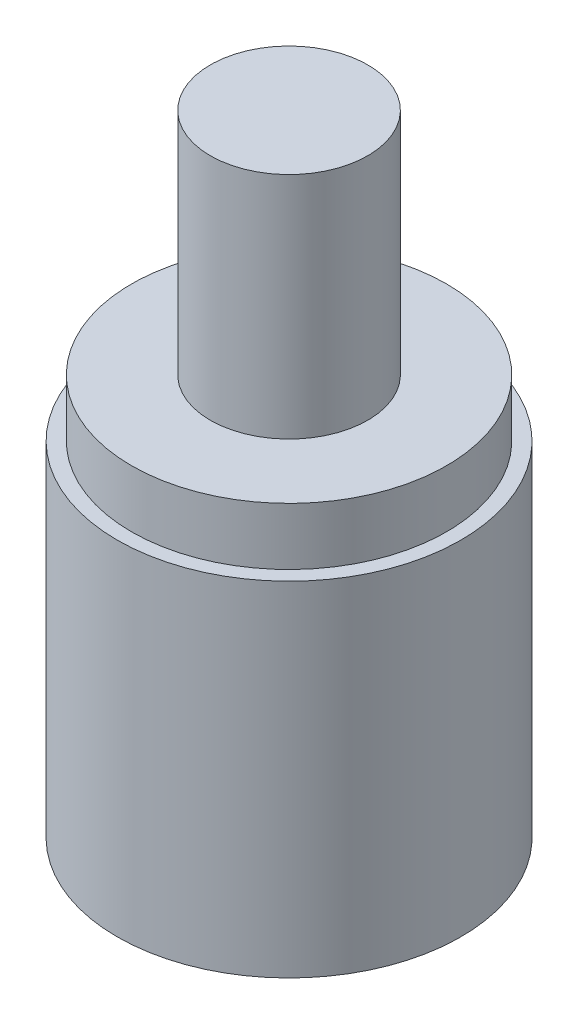
ISO-10303-21;
HEADER;
FILE_DESCRIPTION(('STEP AP214'),'2;1');
FILE_NAME('part.step','',(''),(''),'','','');
FILE_SCHEMA(('AUTOMOTIVE_DESIGN { 1 0 10303 214 1 1 1 1 }'));
ENDSEC;
DATA;
#1=APPLICATION_CONTEXT('core data for automotive mechanical design processes');
#2=APPLICATION_PROTOCOL_DEFINITION('international standard','automotive_design',2000,#1);
#3=PRODUCT_CONTEXT('',#1,'mechanical');
#4=PRODUCT('Part','Part','',(#3));
#5=PRODUCT_RELATED_PRODUCT_CATEGORY('part','',(#4));
#6=PRODUCT_DEFINITION_FORMATION('','',#4);
#7=PRODUCT_DEFINITION_CONTEXT('part definition',#1,'design');
#8=PRODUCT_DEFINITION('design','',#6,#7);
#9=PRODUCT_DEFINITION_SHAPE('','',#8);
#10=(LENGTH_UNIT() NAMED_UNIT(*) SI_UNIT(.MILLI.,.METRE.));
#11=(NAMED_UNIT(*) PLANE_ANGLE_UNIT() SI_UNIT($,.RADIAN.));
#12=(NAMED_UNIT(*) SI_UNIT($,.STERADIAN.) SOLID_ANGLE_UNIT());
#13=UNCERTAINTY_MEASURE_WITH_UNIT(LENGTH_MEASURE(1.E-05),#10,'distance_accuracy_value','');
#14=(GEOMETRIC_REPRESENTATION_CONTEXT(3) GLOBAL_UNCERTAINTY_ASSIGNED_CONTEXT((#13)) GLOBAL_UNIT_ASSIGNED_CONTEXT((#10,
#11,#12)) REPRESENTATION_CONTEXT('',''));
#15=CARTESIAN_POINT('',(0.,0.,0.));
#16=DIRECTION('',(0.,0.,1.));
#17=DIRECTION('',(1.,0.,0.));
#18=AXIS2_PLACEMENT_3D('',#15,#16,#17);
#19=CARTESIAN_POINT('',(0.,12.,0.));
#20=DIRECTION('',(0.,1.,0.));
#21=DIRECTION('',(0.,0.,1.));
#22=AXIS2_PLACEMENT_3D('',#19,#20,#21);
#23=PLANE('',#22);
#24=CARTESIAN_POINT('',(0.,12.,0.));
#25=DIRECTION('',(0.,1.,0.));
#26=DIRECTION('',(0.,0.,1.));
#27=AXIS2_PLACEMENT_3D('',#24,#25,#26);
#28=CIRCLE('',#27,5.5);
#29=CARTESIAN_POINT('',(0.,12.,5.5));
#30=VERTEX_POINT('',#29);
#31=EDGE_CURVE('E52',#30,#30,#28,.T.);
#32=ORIENTED_EDGE('',*,*,#31,.F.);
#33=EDGE_LOOP('',(#32));
#34=FACE_BOUND('',#33,.T.);
#35=CARTESIAN_POINT('',(0.,12.,0.));
#36=DIRECTION('',(0.,1.,0.));
#37=DIRECTION('',(0.,0.,1.));
#38=AXIS2_PLACEMENT_3D('',#35,#36,#37);
#39=CIRCLE('',#38,6.);
#40=CARTESIAN_POINT('',(0.,12.,6.));
#41=VERTEX_POINT('',#40);
#42=EDGE_CURVE('E58',#41,#41,#39,.T.);
#43=ORIENTED_EDGE('',*,*,#42,.T.);
#44=EDGE_LOOP('',(#43));
#45=FACE_BOUND('',#44,.T.);
#46=ADVANCED_FACE('F43',(#34,#45),#23,.T.);
#47=CARTESIAN_POINT('',(0.,0.,0.));
#48=DIRECTION('',(0.,1.,0.));
#49=DIRECTION('',(0.,0.,1.));
#50=AXIS2_PLACEMENT_3D('',#47,#48,#49);
#51=PLANE('',#50);
#52=CARTESIAN_POINT('',(0.,0.,0.));
#53=DIRECTION('',(0.,1.,0.));
#54=DIRECTION('',(0.,0.,1.));
#55=AXIS2_PLACEMENT_3D('',#52,#53,#54);
#56=CIRCLE('',#55,6.);
#57=CARTESIAN_POINT('',(0.,0.,6.));
#58=VERTEX_POINT('',#57);
#59=EDGE_CURVE('E47',#58,#58,#56,.T.);
#60=ORIENTED_EDGE('',*,*,#59,.F.);
#61=EDGE_LOOP('',(#60));
#62=FACE_BOUND('',#61,.T.);
#63=CARTESIAN_POINT('',(0.,0.,0.));
#64=DIRECTION('',(0.,1.,0.));
#65=DIRECTION('',(0.,0.,1.));
#66=AXIS2_PLACEMENT_3D('',#63,#64,#65);
#67=CIRCLE('',#66,4.75);
#68=CARTESIAN_POINT('',(0.,0.,4.75));
#69=VERTEX_POINT('',#68);
#70=EDGE_CURVE('E71',#69,#69,#67,.T.);
#71=ORIENTED_EDGE('',*,*,#70,.T.);
#72=EDGE_LOOP('',(#71));
#73=FACE_BOUND('',#72,.T.);
#74=ADVANCED_FACE('F83',(#62,#73),#51,.F.);
#75=CARTESIAN_POINT('',(0.,12.,0.));
#76=DIRECTION('',(0.,-1.,0.));
#77=DIRECTION('',(0.,0.,-1.));
#78=AXIS2_PLACEMENT_3D('',#75,#76,#77);
#79=CYLINDRICAL_SURFACE('',#78,6.);
#80=ORIENTED_EDGE('',*,*,#42,.F.);
#81=EDGE_LOOP('',(#80));
#82=FACE_BOUND('',#81,.T.);
#83=ORIENTED_EDGE('',*,*,#59,.T.);
#84=EDGE_LOOP('',(#83));
#85=FACE_BOUND('',#84,.T.);
#86=ADVANCED_FACE('F45',(#82,#85),#79,.T.);
#87=CARTESIAN_POINT('',(0.,12.,0.));
#88=DIRECTION('',(0.,-1.,0.));
#89=DIRECTION('',(0.,0.,-1.));
#90=AXIS2_PLACEMENT_3D('',#87,#88,#89);
#91=CYLINDRICAL_SURFACE('',#90,4.75);
#92=CARTESIAN_POINT('',(0.,12.,0.));
#93=DIRECTION('',(0.,1.,0.));
#94=DIRECTION('',(0.,0.,1.));
#95=AXIS2_PLACEMENT_3D('',#92,#93,#94);
#96=CIRCLE('',#95,4.75);
#97=CARTESIAN_POINT('',(0.,12.,4.75));
#98=VERTEX_POINT('',#97);
#99=EDGE_CURVE('E66',#98,#98,#96,.T.);
#100=ORIENTED_EDGE('',*,*,#99,.T.);
#101=EDGE_LOOP('',(#100));
#102=FACE_BOUND('',#101,.T.);
#103=ORIENTED_EDGE('',*,*,#70,.F.);
#104=EDGE_LOOP('',(#103));
#105=FACE_BOUND('',#104,.T.);
#106=ADVANCED_FACE('F88',(#102,#105),#91,.F.);
#107=CARTESIAN_POINT('',(0.,14.,0.));
#108=DIRECTION('',(0.,1.,0.));
#109=DIRECTION('',(0.,0.,1.));
#110=AXIS2_PLACEMENT_3D('',#107,#108,#109);
#111=PLANE('',#110);
#112=CARTESIAN_POINT('',(0.,14.,0.));
#113=DIRECTION('',(0.,1.,0.));
#114=DIRECTION('',(0.,0.,1.));
#115=AXIS2_PLACEMENT_3D('',#112,#113,#114);
#116=CIRCLE('',#115,2.75);
#117=CARTESIAN_POINT('',(0.,14.,2.75));
#118=VERTEX_POINT('',#117);
#119=EDGE_CURVE('E11',#118,#118,#116,.T.);
#120=ORIENTED_EDGE('',*,*,#119,.F.);
#121=EDGE_LOOP('',(#120));
#122=FACE_BOUND('',#121,.T.);
#123=CARTESIAN_POINT('',(0.,14.,0.));
#124=DIRECTION('',(0.,1.,0.));
#125=DIRECTION('',(0.,0.,1.));
#126=AXIS2_PLACEMENT_3D('',#123,#124,#125);
#127=CIRCLE('',#126,5.5);
#128=CARTESIAN_POINT('',(0.,14.,5.5));
#129=VERTEX_POINT('',#128);
#130=EDGE_CURVE('E63',#129,#129,#127,.T.);
#131=ORIENTED_EDGE('',*,*,#130,.T.);
#132=EDGE_LOOP('',(#131));
#133=FACE_BOUND('',#132,.T.);
#134=ADVANCED_FACE('F90',(#122,#133),#111,.T.);
#135=CARTESIAN_POINT('',(0.,14.,0.));
#136=DIRECTION('',(0.,-1.,0.));
#137=DIRECTION('',(0.,0.,-1.));
#138=AXIS2_PLACEMENT_3D('',#135,#136,#137);
#139=CYLINDRICAL_SURFACE('',#138,5.5);
#140=ORIENTED_EDGE('',*,*,#130,.F.);
#141=EDGE_LOOP('',(#140));
#142=FACE_BOUND('',#141,.T.);
#143=ORIENTED_EDGE('',*,*,#31,.T.);
#144=EDGE_LOOP('',(#143));
#145=FACE_BOUND('',#144,.T.);
#146=ADVANCED_FACE('F97',(#142,#145),#139,.T.);
#147=CARTESIAN_POINT('',(0.,12.,0.));
#148=DIRECTION('',(0.,1.,0.));
#149=DIRECTION('',(0.,0.,1.));
#150=AXIS2_PLACEMENT_3D('',#147,#148,#149);
#151=PLANE('',#150);
#152=ORIENTED_EDGE('',*,*,#99,.F.);
#153=EDGE_LOOP('',(#152));
#154=FACE_BOUND('',#153,.T.);
#155=ADVANCED_FACE('F110',(#154),#151,.F.);
#156=CARTESIAN_POINT('',(0.,22.,0.));
#157=DIRECTION('',(0.,-1.,0.));
#158=DIRECTION('',(0.,0.,-1.));
#159=AXIS2_PLACEMENT_3D('',#156,#157,#158);
#160=CYLINDRICAL_SURFACE('',#159,2.75);
#161=CARTESIAN_POINT('',(0.,22.,0.));
#162=DIRECTION('',(0.,1.,0.));
#163=DIRECTION('',(0.,0.,1.));
#164=AXIS2_PLACEMENT_3D('',#161,#162,#163);
#165=CIRCLE('',#164,2.75);
#166=CARTESIAN_POINT('',(0.,22.,2.75));
#167=VERTEX_POINT('',#166);
#168=EDGE_CURVE('E62',#167,#167,#165,.T.);
#169=ORIENTED_EDGE('',*,*,#168,.F.);
#170=EDGE_LOOP('',(#169));
#171=FACE_BOUND('',#170,.T.);
#172=ORIENTED_EDGE('',*,*,#119,.T.);
#173=EDGE_LOOP('',(#172));
#174=FACE_BOUND('',#173,.T.);
#175=ADVANCED_FACE('F115',(#171,#174),#160,.T.);
#176=CARTESIAN_POINT('',(0.,22.,0.));
#177=DIRECTION('',(0.,1.,0.));
#178=DIRECTION('',(0.,0.,1.));
#179=AXIS2_PLACEMENT_3D('',#176,#177,#178);
#180=PLANE('',#179);
#181=ORIENTED_EDGE('',*,*,#168,.T.);
#182=EDGE_LOOP('',(#181));
#183=FACE_BOUND('',#182,.T.);
#184=ADVANCED_FACE('F122',(#183),#180,.T.);
#185=CLOSED_SHELL('',(#46,#74,#86,#106,#134,#146,#155,#175,#184));
#186=MANIFOLD_SOLID_BREP('B2',#185);
#187=ADVANCED_BREP_SHAPE_REPRESENTATION('',(#18,#186),#14);
#188=SHAPE_DEFINITION_REPRESENTATION(#9,#187);
ENDSEC;
END-ISO-10303-21;
